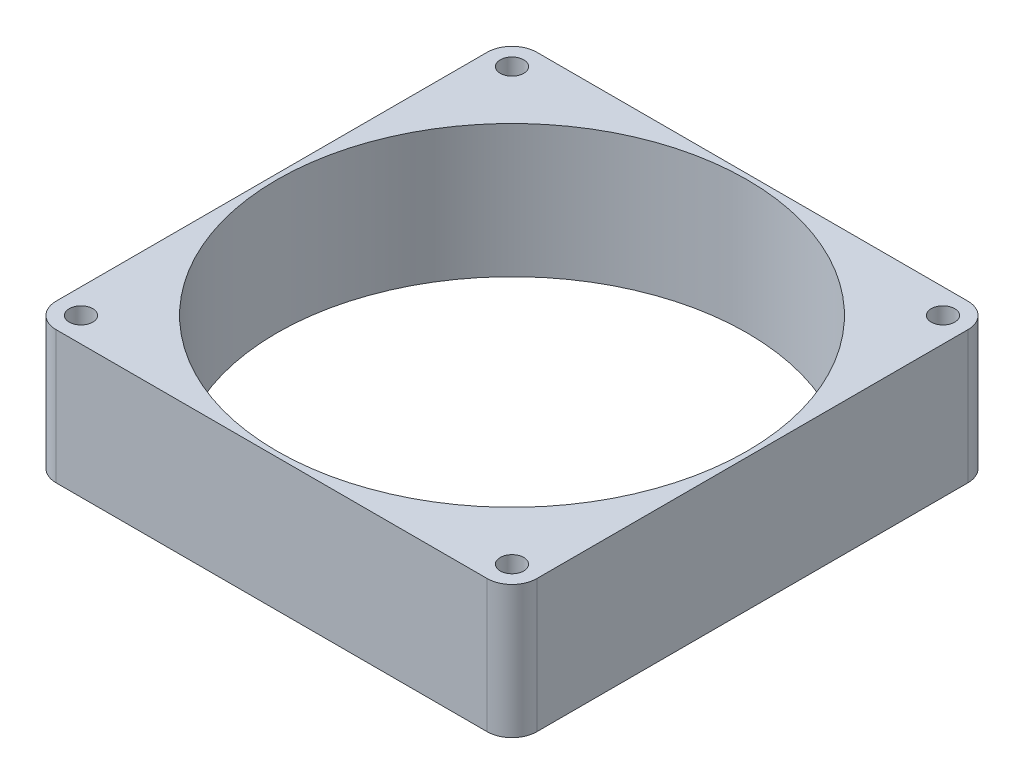
ISO-10303-21;
HEADER;
FILE_DESCRIPTION(('STEP AP214'),'2;1');
FILE_NAME('part.step','',(''),(''),'','','');
FILE_SCHEMA(('AUTOMOTIVE_DESIGN { 1 0 10303 214 1 1 1 1 }'));
ENDSEC;
DATA;
#1=APPLICATION_CONTEXT('core data for automotive mechanical design processes');
#2=APPLICATION_PROTOCOL_DEFINITION('international standard','automotive_design',2000,#1);
#3=PRODUCT_CONTEXT('',#1,'mechanical');
#4=PRODUCT('Part','Part','',(#3));
#5=PRODUCT_RELATED_PRODUCT_CATEGORY('part','',(#4));
#6=PRODUCT_DEFINITION_FORMATION('','',#4);
#7=PRODUCT_DEFINITION_CONTEXT('part definition',#1,'design');
#8=PRODUCT_DEFINITION('design','',#6,#7);
#9=PRODUCT_DEFINITION_SHAPE('','',#8);
#10=(LENGTH_UNIT() NAMED_UNIT(*) SI_UNIT(.MILLI.,.METRE.));
#11=(NAMED_UNIT(*) PLANE_ANGLE_UNIT() SI_UNIT($,.RADIAN.));
#12=(NAMED_UNIT(*) SI_UNIT($,.STERADIAN.) SOLID_ANGLE_UNIT());
#13=UNCERTAINTY_MEASURE_WITH_UNIT(LENGTH_MEASURE(1.E-05),#10,'distance_accuracy_value','');
#14=(GEOMETRIC_REPRESENTATION_CONTEXT(3) GLOBAL_UNCERTAINTY_ASSIGNED_CONTEXT((#13)) GLOBAL_UNIT_ASSIGNED_CONTEXT((#10,
#11,#12)) REPRESENTATION_CONTEXT('',''));
#15=CARTESIAN_POINT('',(0.,0.,0.));
#16=DIRECTION('',(0.,0.,1.));
#17=DIRECTION('',(1.,0.,0.));
#18=AXIS2_PLACEMENT_3D('',#15,#16,#17);
#19=CARTESIAN_POINT('',(41.25,25.4,-41.25));
#20=DIRECTION('',(0.,-1.,0.));
#21=DIRECTION('',(0.,0.,-1.));
#22=AXIS2_PLACEMENT_3D('',#19,#20,#21);
#23=PLANE('',#22);
#24=CARTESIAN_POINT('',(41.25,25.4,-41.25));
#25=DIRECTION('',(0.,1.,0.));
#26=DIRECTION('',(0.,0.,-1.));
#27=AXIS2_PLACEMENT_3D('',#24,#25,#26);
#28=CIRCLE('',#27,4.75);
#29=CARTESIAN_POINT('',(46.,25.4,-41.25));
#30=VERTEX_POINT('',#29);
#31=CARTESIAN_POINT('',(41.25,25.4,-46.));
#32=VERTEX_POINT('',#31);
#33=EDGE_CURVE('E164',#30,#32,#28,.T.);
#34=ORIENTED_EDGE('',*,*,#33,.T.);
#35=DIRECTION('',(-1.,0.,0.));
#36=VECTOR('',#35,1.);
#37=CARTESIAN_POINT('',(-41.25,25.4,-46.));
#38=LINE('',#37,#36);
#39=CARTESIAN_POINT('',(-41.25,25.4,-46.));
#40=VERTEX_POINT('',#39);
#41=EDGE_CURVE('E100',#32,#40,#38,.T.);
#42=ORIENTED_EDGE('',*,*,#41,.T.);
#43=CARTESIAN_POINT('',(-41.25,25.4,-41.25));
#44=DIRECTION('',(0.,1.,0.));
#45=DIRECTION('',(0.,0.,-1.));
#46=AXIS2_PLACEMENT_3D('',#43,#44,#45);
#47=CIRCLE('',#46,4.75);
#48=CARTESIAN_POINT('',(-46.,25.4,-41.25));
#49=VERTEX_POINT('',#48);
#50=EDGE_CURVE('E185',#40,#49,#47,.T.);
#51=ORIENTED_EDGE('',*,*,#50,.T.);
#52=DIRECTION('',(0.,0.,1.));
#53=VECTOR('',#52,1.);
#54=CARTESIAN_POINT('',(-46.,25.4,41.25));
#55=LINE('',#54,#53);
#56=CARTESIAN_POINT('',(-46.,25.4,41.25));
#57=VERTEX_POINT('',#56);
#58=EDGE_CURVE('E199',#49,#57,#55,.T.);
#59=ORIENTED_EDGE('',*,*,#58,.T.);
#60=CARTESIAN_POINT('',(-41.25,25.4,41.25));
#61=DIRECTION('',(0.,1.,0.));
#62=DIRECTION('',(0.,0.,-1.));
#63=AXIS2_PLACEMENT_3D('',#60,#61,#62);
#64=CIRCLE('',#63,4.75);
#65=CARTESIAN_POINT('',(-41.25,25.4,46.));
#66=VERTEX_POINT('',#65);
#67=EDGE_CURVE('E119',#57,#66,#64,.T.);
#68=ORIENTED_EDGE('',*,*,#67,.T.);
#69=DIRECTION('',(1.,0.,0.));
#70=VECTOR('',#69,1.);
#71=CARTESIAN_POINT('',(-41.25,25.4,46.));
#72=LINE('',#71,#70);
#73=CARTESIAN_POINT('',(41.25,25.4,46.));
#74=VERTEX_POINT('',#73);
#75=EDGE_CURVE('E113',#66,#74,#72,.T.);
#76=ORIENTED_EDGE('',*,*,#75,.T.);
#77=CARTESIAN_POINT('',(41.25,25.4,41.25));
#78=DIRECTION('',(0.,1.,0.));
#79=DIRECTION('',(0.,0.,1.));
#80=AXIS2_PLACEMENT_3D('',#77,#78,#79);
#81=CIRCLE('',#80,4.75);
#82=CARTESIAN_POINT('',(46.,25.4,41.25));
#83=VERTEX_POINT('',#82);
#84=EDGE_CURVE('E117',#74,#83,#81,.T.);
#85=ORIENTED_EDGE('',*,*,#84,.T.);
#86=DIRECTION('',(0.,0.,-1.));
#87=VECTOR('',#86,1.);
#88=CARTESIAN_POINT('',(46.,25.4,41.25));
#89=LINE('',#88,#87);
#90=EDGE_CURVE('E57',#83,#30,#89,.T.);
#91=ORIENTED_EDGE('',*,*,#90,.T.);
#92=EDGE_LOOP('',(#34,#42,#51,#59,#68,#76,#85,#91));
#93=FACE_BOUND('',#92,.T.);
#94=CARTESIAN_POINT('',(0.,25.4,0.));
#95=DIRECTION('',(0.,1.,0.));
#96=DIRECTION('',(0.,0.,1.));
#97=AXIS2_PLACEMENT_3D('',#94,#95,#96);
#98=CIRCLE('',#97,45.);
#99=CARTESIAN_POINT('',(0.,25.4,45.));
#100=VERTEX_POINT('',#99);
#101=EDGE_CURVE('E146',#100,#100,#98,.T.);
#102=ORIENTED_EDGE('',*,*,#101,.F.);
#103=EDGE_LOOP('',(#102));
#104=FACE_BOUND('',#103,.T.);
#105=CARTESIAN_POINT('',(-41.25,25.4,-41.25));
#106=DIRECTION('',(0.,1.,0.));
#107=DIRECTION('',(0.,0.,1.));
#108=AXIS2_PLACEMENT_3D('',#105,#106,#107);
#109=CIRCLE('',#108,2.25);
#110=CARTESIAN_POINT('',(-41.25,25.4,-39.));
#111=VERTEX_POINT('',#110);
#112=EDGE_CURVE('E213',#111,#111,#109,.T.);
#113=ORIENTED_EDGE('',*,*,#112,.F.);
#114=EDGE_LOOP('',(#113));
#115=FACE_BOUND('',#114,.T.);
#116=CARTESIAN_POINT('',(41.25,25.4,-41.25));
#117=DIRECTION('',(0.,1.,0.));
#118=DIRECTION('',(0.,0.,-1.));
#119=AXIS2_PLACEMENT_3D('',#116,#117,#118);
#120=CIRCLE('',#119,2.25);
#121=CARTESIAN_POINT('',(41.25,25.4,-43.5));
#122=VERTEX_POINT('',#121);
#123=EDGE_CURVE('E221',#122,#122,#120,.T.);
#124=ORIENTED_EDGE('',*,*,#123,.F.);
#125=EDGE_LOOP('',(#124));
#126=FACE_BOUND('',#125,.T.);
#127=CARTESIAN_POINT('',(41.25,25.4,41.25));
#128=DIRECTION('',(0.,1.,0.));
#129=DIRECTION('',(0.,0.,1.));
#130=AXIS2_PLACEMENT_3D('',#127,#128,#129);
#131=CIRCLE('',#130,2.25);
#132=CARTESIAN_POINT('',(41.25,25.4,43.5));
#133=VERTEX_POINT('',#132);
#134=EDGE_CURVE('E229',#133,#133,#131,.T.);
#135=ORIENTED_EDGE('',*,*,#134,.F.);
#136=EDGE_LOOP('',(#135));
#137=FACE_BOUND('',#136,.T.);
#138=CARTESIAN_POINT('',(-41.25,25.4,41.25));
#139=DIRECTION('',(0.,1.,0.));
#140=DIRECTION('',(0.,0.,-1.));
#141=AXIS2_PLACEMENT_3D('',#138,#139,#140);
#142=CIRCLE('',#141,2.25);
#143=CARTESIAN_POINT('',(-41.25,25.4,39.));
#144=VERTEX_POINT('',#143);
#145=EDGE_CURVE('E237',#144,#144,#142,.T.);
#146=ORIENTED_EDGE('',*,*,#145,.F.);
#147=EDGE_LOOP('',(#146));
#148=FACE_BOUND('',#147,.T.);
#149=ADVANCED_FACE('F39',(#93,#104,#115,#126,#137,#148),#23,.F.);
#150=CARTESIAN_POINT('',(41.25,0.,-41.25));
#151=DIRECTION('',(0.,-1.,0.));
#152=DIRECTION('',(0.,0.,-1.));
#153=AXIS2_PLACEMENT_3D('',#150,#151,#152);
#154=PLANE('',#153);
#155=CARTESIAN_POINT('',(41.25,0.,41.25));
#156=DIRECTION('',(0.,1.,0.));
#157=DIRECTION('',(0.,0.,1.));
#158=AXIS2_PLACEMENT_3D('',#155,#156,#157);
#159=CIRCLE('',#158,2.25);
#160=CARTESIAN_POINT('',(41.25,0.,43.5));
#161=VERTEX_POINT('',#160);
#162=EDGE_CURVE('E233',#161,#161,#159,.T.);
#163=ORIENTED_EDGE('',*,*,#162,.T.);
#164=EDGE_LOOP('',(#163));
#165=FACE_BOUND('',#164,.T.);
#166=CARTESIAN_POINT('',(-41.25,0.,-41.25));
#167=DIRECTION('',(0.,1.,0.));
#168=DIRECTION('',(0.,0.,1.));
#169=AXIS2_PLACEMENT_3D('',#166,#167,#168);
#170=CIRCLE('',#169,2.25);
#171=CARTESIAN_POINT('',(-41.25,0.,-39.));
#172=VERTEX_POINT('',#171);
#173=EDGE_CURVE('E217',#172,#172,#170,.T.);
#174=ORIENTED_EDGE('',*,*,#173,.T.);
#175=EDGE_LOOP('',(#174));
#176=FACE_BOUND('',#175,.T.);
#177=CARTESIAN_POINT('',(41.25,0.,-41.25));
#178=DIRECTION('',(0.,1.,0.));
#179=DIRECTION('',(0.,0.,-1.));
#180=AXIS2_PLACEMENT_3D('',#177,#178,#179);
#181=CIRCLE('',#180,4.75);
#182=CARTESIAN_POINT('',(46.,0.,-41.25));
#183=VERTEX_POINT('',#182);
#184=CARTESIAN_POINT('',(41.25,0.,-46.));
#185=VERTEX_POINT('',#184);
#186=EDGE_CURVE('E141',#183,#185,#181,.T.);
#187=ORIENTED_EDGE('',*,*,#186,.F.);
#188=DIRECTION('',(0.,0.,-1.));
#189=VECTOR('',#188,1.);
#190=CARTESIAN_POINT('',(46.,0.,41.25));
#191=LINE('',#190,#189);
#192=CARTESIAN_POINT('',(46.,0.,41.25));
#193=VERTEX_POINT('',#192);
#194=EDGE_CURVE('E92',#193,#183,#191,.T.);
#195=ORIENTED_EDGE('',*,*,#194,.F.);
#196=CARTESIAN_POINT('',(41.25,0.,41.25));
#197=DIRECTION('',(0.,1.,0.));
#198=DIRECTION('',(0.,0.,1.));
#199=AXIS2_PLACEMENT_3D('',#196,#197,#198);
#200=CIRCLE('',#199,4.75);
#201=CARTESIAN_POINT('',(41.25,0.,46.));
#202=VERTEX_POINT('',#201);
#203=EDGE_CURVE('E86',#202,#193,#200,.T.);
#204=ORIENTED_EDGE('',*,*,#203,.F.);
#205=DIRECTION('',(1.,0.,0.));
#206=VECTOR('',#205,1.);
#207=CARTESIAN_POINT('',(-41.25,0.,46.));
#208=LINE('',#207,#206);
#209=CARTESIAN_POINT('',(-41.25,0.,46.));
#210=VERTEX_POINT('',#209);
#211=EDGE_CURVE('E128',#210,#202,#208,.T.);
#212=ORIENTED_EDGE('',*,*,#211,.F.);
#213=CARTESIAN_POINT('',(-41.25,0.,41.25));
#214=DIRECTION('',(0.,1.,0.));
#215=DIRECTION('',(0.,0.,-1.));
#216=AXIS2_PLACEMENT_3D('',#213,#214,#215);
#217=CIRCLE('',#216,4.75);
#218=CARTESIAN_POINT('',(-46.,0.,41.25));
#219=VERTEX_POINT('',#218);
#220=EDGE_CURVE('E155',#219,#210,#217,.T.);
#221=ORIENTED_EDGE('',*,*,#220,.F.);
#222=DIRECTION('',(0.,0.,1.));
#223=VECTOR('',#222,1.);
#224=CARTESIAN_POINT('',(-46.,0.,41.25));
#225=LINE('',#224,#223);
#226=CARTESIAN_POINT('',(-46.,0.,-41.25));
#227=VERTEX_POINT('',#226);
#228=EDGE_CURVE('E152',#227,#219,#225,.T.);
#229=ORIENTED_EDGE('',*,*,#228,.F.);
#230=CARTESIAN_POINT('',(-41.25,0.,-41.25));
#231=DIRECTION('',(0.,1.,0.));
#232=DIRECTION('',(0.,0.,-1.));
#233=AXIS2_PLACEMENT_3D('',#230,#231,#232);
#234=CIRCLE('',#233,4.75);
#235=CARTESIAN_POINT('',(-41.25,0.,-46.));
#236=VERTEX_POINT('',#235);
#237=EDGE_CURVE('E149',#236,#227,#234,.T.);
#238=ORIENTED_EDGE('',*,*,#237,.F.);
#239=DIRECTION('',(-1.,0.,0.));
#240=VECTOR('',#239,1.);
#241=CARTESIAN_POINT('',(-41.25,0.,-46.));
#242=LINE('',#241,#240);
#243=EDGE_CURVE('E145',#185,#236,#242,.T.);
#244=ORIENTED_EDGE('',*,*,#243,.F.);
#245=EDGE_LOOP('',(#187,#195,#204,#212,#221,#229,#238,#244));
#246=FACE_BOUND('',#245,.T.);
#247=CARTESIAN_POINT('',(0.,0.,0.));
#248=DIRECTION('',(0.,1.,0.));
#249=DIRECTION('',(0.,0.,1.));
#250=AXIS2_PLACEMENT_3D('',#247,#248,#249);
#251=CIRCLE('',#250,45.);
#252=CARTESIAN_POINT('',(0.,0.,45.));
#253=VERTEX_POINT('',#252);
#254=EDGE_CURVE('E209',#253,#253,#251,.T.);
#255=ORIENTED_EDGE('',*,*,#254,.T.);
#256=EDGE_LOOP('',(#255));
#257=FACE_BOUND('',#256,.T.);
#258=CARTESIAN_POINT('',(41.25,0.,-41.25));
#259=DIRECTION('',(0.,1.,0.));
#260=DIRECTION('',(0.,0.,-1.));
#261=AXIS2_PLACEMENT_3D('',#258,#259,#260);
#262=CIRCLE('',#261,2.25);
#263=CARTESIAN_POINT('',(41.25,0.,-43.5));
#264=VERTEX_POINT('',#263);
#265=EDGE_CURVE('E225',#264,#264,#262,.T.);
#266=ORIENTED_EDGE('',*,*,#265,.T.);
#267=EDGE_LOOP('',(#266));
#268=FACE_BOUND('',#267,.T.);
#269=CARTESIAN_POINT('',(-41.25,0.,41.25));
#270=DIRECTION('',(0.,1.,0.));
#271=DIRECTION('',(0.,0.,-1.));
#272=AXIS2_PLACEMENT_3D('',#269,#270,#271);
#273=CIRCLE('',#272,2.25);
#274=CARTESIAN_POINT('',(-41.25,0.,39.));
#275=VERTEX_POINT('',#274);
#276=EDGE_CURVE('E241',#275,#275,#273,.T.);
#277=ORIENTED_EDGE('',*,*,#276,.T.);
#278=EDGE_LOOP('',(#277));
#279=FACE_BOUND('',#278,.T.);
#280=ADVANCED_FACE('F189',(#165,#176,#246,#257,#268,#279),#154,.T.);
#281=CARTESIAN_POINT('',(41.25,25.4,-41.25));
#282=DIRECTION('',(0.,-1.,0.));
#283=DIRECTION('',(0.,0.,-1.));
#284=AXIS2_PLACEMENT_3D('',#281,#282,#283);
#285=CYLINDRICAL_SURFACE('',#284,4.75);
#286=ORIENTED_EDGE('',*,*,#186,.T.);
#287=DIRECTION('',(0.,-1.,0.));
#288=VECTOR('',#287,1.);
#289=CARTESIAN_POINT('',(41.25,25.4,-46.));
#290=LINE('',#289,#288);
#291=EDGE_CURVE('E11',#32,#185,#290,.T.);
#292=ORIENTED_EDGE('',*,*,#291,.F.);
#293=ORIENTED_EDGE('',*,*,#33,.F.);
#294=DIRECTION('',(0.,-1.,0.));
#295=VECTOR('',#294,1.);
#296=CARTESIAN_POINT('',(46.,25.4,-41.25));
#297=LINE('',#296,#295);
#298=EDGE_CURVE('E137',#30,#183,#297,.T.);
#299=ORIENTED_EDGE('',*,*,#298,.T.);
#300=EDGE_LOOP('',(#286,#292,#293,#299));
#301=FACE_BOUND('',#300,.T.);
#302=ADVANCED_FACE('F41',(#301),#285,.T.);
#303=CARTESIAN_POINT('',(-41.25,25.4,-46.));
#304=DIRECTION('',(0.,0.,1.));
#305=DIRECTION('',(1.,0.,0.));
#306=AXIS2_PLACEMENT_3D('',#303,#304,#305);
#307=PLANE('',#306);
#308=ORIENTED_EDGE('',*,*,#243,.T.);
#309=DIRECTION('',(0.,-1.,0.));
#310=VECTOR('',#309,1.);
#311=CARTESIAN_POINT('',(-41.25,25.4,-46.));
#312=LINE('',#311,#310);
#313=EDGE_CURVE('E49',#40,#236,#312,.T.);
#314=ORIENTED_EDGE('',*,*,#313,.F.);
#315=ORIENTED_EDGE('',*,*,#41,.F.);
#316=ORIENTED_EDGE('',*,*,#291,.T.);
#317=EDGE_LOOP('',(#308,#314,#315,#316));
#318=FACE_BOUND('',#317,.T.);
#319=ADVANCED_FACE('F275',(#318),#307,.F.);
#320=CARTESIAN_POINT('',(-41.25,25.4,-41.25));
#321=DIRECTION('',(0.,-1.,0.));
#322=DIRECTION('',(0.,0.,-1.));
#323=AXIS2_PLACEMENT_3D('',#320,#321,#322);
#324=CYLINDRICAL_SURFACE('',#323,4.75);
#325=ORIENTED_EDGE('',*,*,#237,.T.);
#326=DIRECTION('',(0.,-1.,0.));
#327=VECTOR('',#326,1.);
#328=CARTESIAN_POINT('',(-46.,25.4,-41.25));
#329=LINE('',#328,#327);
#330=EDGE_CURVE('E175',#49,#227,#329,.T.);
#331=ORIENTED_EDGE('',*,*,#330,.F.);
#332=ORIENTED_EDGE('',*,*,#50,.F.);
#333=ORIENTED_EDGE('',*,*,#313,.T.);
#334=EDGE_LOOP('',(#325,#331,#332,#333));
#335=FACE_BOUND('',#334,.T.);
#336=ADVANCED_FACE('F183',(#335),#324,.T.);
#337=CARTESIAN_POINT('',(-46.,25.4,41.25));
#338=DIRECTION('',(1.,0.,0.));
#339=DIRECTION('',(0.,0.,-1.));
#340=AXIS2_PLACEMENT_3D('',#337,#338,#339);
#341=PLANE('',#340);
#342=ORIENTED_EDGE('',*,*,#228,.T.);
#343=DIRECTION('',(0.,-1.,0.));
#344=VECTOR('',#343,1.);
#345=CARTESIAN_POINT('',(-46.,25.4,41.25));
#346=LINE('',#345,#344);
#347=EDGE_CURVE('E171',#57,#219,#346,.T.);
#348=ORIENTED_EDGE('',*,*,#347,.F.);
#349=ORIENTED_EDGE('',*,*,#58,.F.);
#350=ORIENTED_EDGE('',*,*,#330,.T.);
#351=EDGE_LOOP('',(#342,#348,#349,#350));
#352=FACE_BOUND('',#351,.T.);
#353=ADVANCED_FACE('F194',(#352),#341,.F.);
#354=CARTESIAN_POINT('',(-41.25,25.4,41.25));
#355=DIRECTION('',(0.,-1.,0.));
#356=DIRECTION('',(0.,0.,-1.));
#357=AXIS2_PLACEMENT_3D('',#354,#355,#356);
#358=CYLINDRICAL_SURFACE('',#357,4.75);
#359=ORIENTED_EDGE('',*,*,#220,.T.);
#360=DIRECTION('',(0.,-1.,0.));
#361=VECTOR('',#360,1.);
#362=CARTESIAN_POINT('',(-41.25,25.4,46.));
#363=LINE('',#362,#361);
#364=EDGE_CURVE('E130',#66,#210,#363,.T.);
#365=ORIENTED_EDGE('',*,*,#364,.F.);
#366=ORIENTED_EDGE('',*,*,#67,.F.);
#367=ORIENTED_EDGE('',*,*,#347,.T.);
#368=EDGE_LOOP('',(#359,#365,#366,#367));
#369=FACE_BOUND('',#368,.T.);
#370=ADVANCED_FACE('F197',(#369),#358,.T.);
#371=CARTESIAN_POINT('',(-41.25,25.4,46.));
#372=DIRECTION('',(0.,0.,-1.));
#373=DIRECTION('',(-1.,0.,0.));
#374=AXIS2_PLACEMENT_3D('',#371,#372,#373);
#375=PLANE('',#374);
#376=ORIENTED_EDGE('',*,*,#211,.T.);
#377=DIRECTION('',(0.,-1.,0.));
#378=VECTOR('',#377,1.);
#379=CARTESIAN_POINT('',(41.25,25.4,46.));
#380=LINE('',#379,#378);
#381=EDGE_CURVE('E125',#74,#202,#380,.T.);
#382=ORIENTED_EDGE('',*,*,#381,.F.);
#383=ORIENTED_EDGE('',*,*,#75,.F.);
#384=ORIENTED_EDGE('',*,*,#364,.T.);
#385=EDGE_LOOP('',(#376,#382,#383,#384));
#386=FACE_BOUND('',#385,.T.);
#387=ADVANCED_FACE('F126',(#386),#375,.F.);
#388=CARTESIAN_POINT('',(41.25,25.4,41.25));
#389=DIRECTION('',(0.,-1.,0.));
#390=DIRECTION('',(0.,0.,-1.));
#391=AXIS2_PLACEMENT_3D('',#388,#389,#390);
#392=CYLINDRICAL_SURFACE('',#391,4.75);
#393=ORIENTED_EDGE('',*,*,#203,.T.);
#394=DIRECTION('',(0.,-1.,0.));
#395=VECTOR('',#394,1.);
#396=CARTESIAN_POINT('',(46.,25.4,41.25));
#397=LINE('',#396,#395);
#398=EDGE_CURVE('E131',#83,#193,#397,.T.);
#399=ORIENTED_EDGE('',*,*,#398,.F.);
#400=ORIENTED_EDGE('',*,*,#84,.F.);
#401=ORIENTED_EDGE('',*,*,#381,.T.);
#402=EDGE_LOOP('',(#393,#399,#400,#401));
#403=FACE_BOUND('',#402,.T.);
#404=ADVANCED_FACE('F133',(#403),#392,.T.);
#405=CARTESIAN_POINT('',(46.,25.4,41.25));
#406=DIRECTION('',(-1.,0.,0.));
#407=DIRECTION('',(0.,0.,1.));
#408=AXIS2_PLACEMENT_3D('',#405,#406,#407);
#409=PLANE('',#408);
#410=ORIENTED_EDGE('',*,*,#194,.T.);
#411=ORIENTED_EDGE('',*,*,#298,.F.);
#412=ORIENTED_EDGE('',*,*,#90,.F.);
#413=ORIENTED_EDGE('',*,*,#398,.T.);
#414=EDGE_LOOP('',(#410,#411,#412,#413));
#415=FACE_BOUND('',#414,.T.);
#416=ADVANCED_FACE('F263',(#415),#409,.F.);
#417=CARTESIAN_POINT('',(0.,25.4,0.));
#418=DIRECTION('',(0.,-1.,0.));
#419=DIRECTION('',(0.,0.,-1.));
#420=AXIS2_PLACEMENT_3D('',#417,#418,#419);
#421=CYLINDRICAL_SURFACE('',#420,45.);
#422=ORIENTED_EDGE('',*,*,#101,.T.);
#423=EDGE_LOOP('',(#422));
#424=FACE_BOUND('',#423,.T.);
#425=ORIENTED_EDGE('',*,*,#254,.F.);
#426=EDGE_LOOP('',(#425));
#427=FACE_BOUND('',#426,.T.);
#428=ADVANCED_FACE('F260',(#424,#427),#421,.F.);
#429=CARTESIAN_POINT('',(-41.25,25.4,-41.25));
#430=DIRECTION('',(0.,-1.,0.));
#431=DIRECTION('',(0.,0.,-1.));
#432=AXIS2_PLACEMENT_3D('',#429,#430,#431);
#433=CYLINDRICAL_SURFACE('',#432,2.25);
#434=ORIENTED_EDGE('',*,*,#112,.T.);
#435=EDGE_LOOP('',(#434));
#436=FACE_BOUND('',#435,.T.);
#437=ORIENTED_EDGE('',*,*,#173,.F.);
#438=EDGE_LOOP('',(#437));
#439=FACE_BOUND('',#438,.T.);
#440=ADVANCED_FACE('F339',(#436,#439),#433,.F.);
#441=CARTESIAN_POINT('',(41.25,25.4,-41.25));
#442=DIRECTION('',(0.,-1.,0.));
#443=DIRECTION('',(0.,0.,-1.));
#444=AXIS2_PLACEMENT_3D('',#441,#442,#443);
#445=CYLINDRICAL_SURFACE('',#444,2.25);
#446=ORIENTED_EDGE('',*,*,#123,.T.);
#447=EDGE_LOOP('',(#446));
#448=FACE_BOUND('',#447,.T.);
#449=ORIENTED_EDGE('',*,*,#265,.F.);
#450=EDGE_LOOP('',(#449));
#451=FACE_BOUND('',#450,.T.);
#452=ADVANCED_FACE('F347',(#448,#451),#445,.F.);
#453=CARTESIAN_POINT('',(41.25,25.4,41.25));
#454=DIRECTION('',(0.,-1.,0.));
#455=DIRECTION('',(0.,0.,-1.));
#456=AXIS2_PLACEMENT_3D('',#453,#454,#455);
#457=CYLINDRICAL_SURFACE('',#456,2.25);
#458=ORIENTED_EDGE('',*,*,#134,.T.);
#459=EDGE_LOOP('',(#458));
#460=FACE_BOUND('',#459,.T.);
#461=ORIENTED_EDGE('',*,*,#162,.F.);
#462=EDGE_LOOP('',(#461));
#463=FACE_BOUND('',#462,.T.);
#464=ADVANCED_FACE('F355',(#460,#463),#457,.F.);
#465=CARTESIAN_POINT('',(-41.25,25.4,41.25));
#466=DIRECTION('',(0.,-1.,0.));
#467=DIRECTION('',(0.,0.,-1.));
#468=AXIS2_PLACEMENT_3D('',#465,#466,#467);
#469=CYLINDRICAL_SURFACE('',#468,2.25);
#470=ORIENTED_EDGE('',*,*,#145,.T.);
#471=EDGE_LOOP('',(#470));
#472=FACE_BOUND('',#471,.T.);
#473=ORIENTED_EDGE('',*,*,#276,.F.);
#474=EDGE_LOOP('',(#473));
#475=FACE_BOUND('',#474,.T.);
#476=ADVANCED_FACE('F249',(#472,#475),#469,.F.);
#477=CLOSED_SHELL('',(#149,#280,#302,#319,#336,#353,#370,#387,#404,#416,#428,#440,#452,#464,#476));
#478=MANIFOLD_SOLID_BREP('B2',#477);
#479=ADVANCED_BREP_SHAPE_REPRESENTATION('',(#18,#478),#14);
#480=SHAPE_DEFINITION_REPRESENTATION(#9,#479);
ENDSEC;
END-ISO-10303-21;
